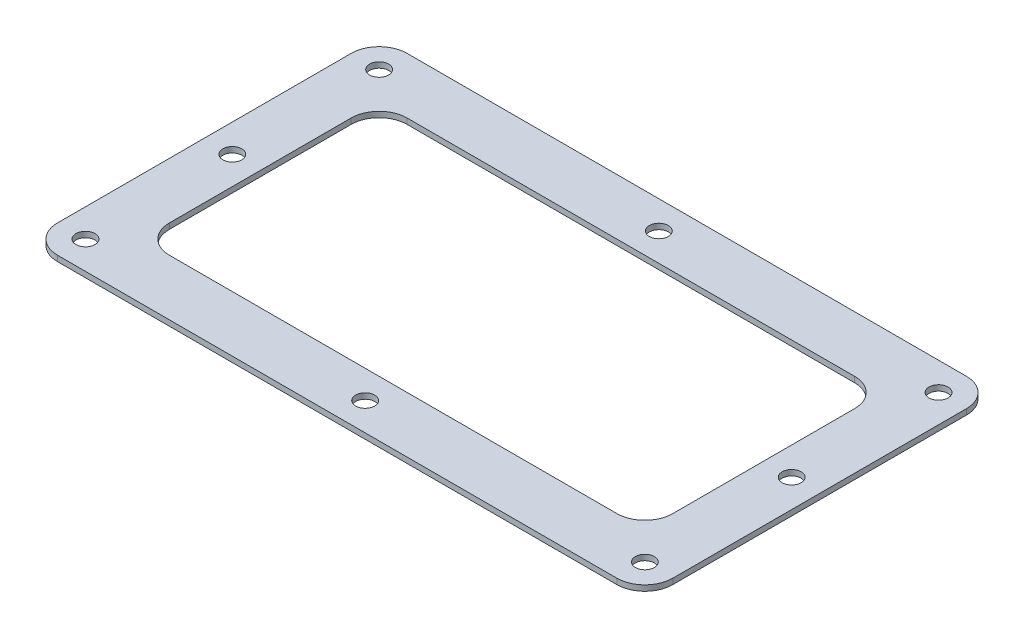
ISO-10303-21;
HEADER;
FILE_DESCRIPTION(('STEP AP214'),'2;1');
FILE_NAME('part.step','',(''),(''),'','','');
FILE_SCHEMA(('AUTOMOTIVE_DESIGN { 1 0 10303 214 1 1 1 1 }'));
ENDSEC;
DATA;
#1=APPLICATION_CONTEXT('core data for automotive mechanical design processes');
#2=APPLICATION_PROTOCOL_DEFINITION('international standard','automotive_design',2000,#1);
#3=PRODUCT_CONTEXT('',#1,'mechanical');
#4=PRODUCT('Part','Part','',(#3));
#5=PRODUCT_RELATED_PRODUCT_CATEGORY('part','',(#4));
#6=PRODUCT_DEFINITION_FORMATION('','',#4);
#7=PRODUCT_DEFINITION_CONTEXT('part definition',#1,'design');
#8=PRODUCT_DEFINITION('design','',#6,#7);
#9=PRODUCT_DEFINITION_SHAPE('','',#8);
#10=(LENGTH_UNIT() NAMED_UNIT(*) SI_UNIT(.MILLI.,.METRE.));
#11=(NAMED_UNIT(*) PLANE_ANGLE_UNIT() SI_UNIT($,.RADIAN.));
#12=(NAMED_UNIT(*) SI_UNIT($,.STERADIAN.) SOLID_ANGLE_UNIT());
#13=UNCERTAINTY_MEASURE_WITH_UNIT(LENGTH_MEASURE(1.E-05),#10,'distance_accuracy_value','');
#14=(GEOMETRIC_REPRESENTATION_CONTEXT(3) GLOBAL_UNCERTAINTY_ASSIGNED_CONTEXT((#13)) GLOBAL_UNIT_ASSIGNED_CONTEXT((#10,
#11,#12)) REPRESENTATION_CONTEXT('',''));
#15=CARTESIAN_POINT('',(0.,0.,0.));
#16=DIRECTION('',(0.,0.,1.));
#17=DIRECTION('',(1.,0.,0.));
#18=AXIS2_PLACEMENT_3D('',#15,#16,#17);
#19=CARTESIAN_POINT('',(142.674698795181,0.,88.0963855421687));
#20=DIRECTION('',(0.,-1.,0.));
#21=DIRECTION('',(0.,0.,-1.));
#22=AXIS2_PLACEMENT_3D('',#19,#20,#21);
#23=PLANE('',#22);
#24=DIRECTION('',(-1.,0.,0.));
#25=VECTOR('',#24,1.);
#26=CARTESIAN_POINT('',(0.,0.,-6.90361445783139));
#27=LINE('',#26,#25);
#28=CARTESIAN_POINT('',(122.674698795181,0.,-6.90361445783128));
#29=VERTEX_POINT('',#28);
#30=CARTESIAN_POINT('',(-37.3253012048192,2.22044604925031E-13,-6.90361445783128));
#31=VERTEX_POINT('',#30);
#32=EDGE_CURVE('E151',#29,#31,#27,.T.);
#33=ORIENTED_EDGE('',*,*,#32,.T.);
#34=CARTESIAN_POINT('',(-37.3253012048192,2.22044604925031E-13,3.09638554216862));
#35=DIRECTION('',(0.,1.,0.));
#36=DIRECTION('',(0.,0.,1.));
#37=AXIS2_PLACEMENT_3D('',#34,#35,#36);
#38=CIRCLE('',#37,10.);
#39=CARTESIAN_POINT('',(-47.3253012048192,0.,3.09638554216873));
#40=VERTEX_POINT('',#39);
#41=EDGE_CURVE('E160',#31,#40,#38,.T.);
#42=ORIENTED_EDGE('',*,*,#41,.T.);
#43=DIRECTION('',(0.,0.,1.));
#44=VECTOR('',#43,1.);
#45=CARTESIAN_POINT('',(-47.3253012048192,0.,0.));
#46=LINE('',#45,#44);
#47=CARTESIAN_POINT('',(-47.3253012048192,2.22044604925031E-13,68.0963855421686));
#48=VERTEX_POINT('',#47);
#49=EDGE_CURVE('E51',#40,#48,#46,.T.);
#50=ORIENTED_EDGE('',*,*,#49,.T.);
#51=CARTESIAN_POINT('',(-37.3253012048193,2.22044604925031E-13,68.0963855421687));
#52=DIRECTION('',(0.,1.,0.));
#53=DIRECTION('',(0.,0.,1.));
#54=AXIS2_PLACEMENT_3D('',#51,#52,#53);
#55=CIRCLE('',#54,10.);
#56=CARTESIAN_POINT('',(-37.3253012048192,2.22044604925031E-13,78.0963855421687));
#57=VERTEX_POINT('',#56);
#58=EDGE_CURVE('E174',#48,#57,#55,.T.);
#59=ORIENTED_EDGE('',*,*,#58,.T.);
#60=DIRECTION('',(1.,0.,0.));
#61=VECTOR('',#60,1.);
#62=CARTESIAN_POINT('',(0.,0.,78.0963855421687));
#63=LINE('',#62,#61);
#64=CARTESIAN_POINT('',(122.674698795181,0.,78.0963855421688));
#65=VERTEX_POINT('',#64);
#66=EDGE_CURVE('E177',#57,#65,#63,.T.);
#67=ORIENTED_EDGE('',*,*,#66,.T.);
#68=CARTESIAN_POINT('',(122.674698795181,0.,68.0963855421688));
#69=DIRECTION('',(0.,1.,0.));
#70=DIRECTION('',(0.,0.,1.));
#71=AXIS2_PLACEMENT_3D('',#68,#69,#70);
#72=CIRCLE('',#71,9.99999999999999);
#73=CARTESIAN_POINT('',(132.674698795181,0.,68.0963855421687));
#74=VERTEX_POINT('',#73);
#75=EDGE_CURVE('E180',#65,#74,#72,.T.);
#76=ORIENTED_EDGE('',*,*,#75,.T.);
#77=DIRECTION('',(0.,0.,-1.));
#78=VECTOR('',#77,1.);
#79=CARTESIAN_POINT('',(132.674698795181,0.,1.11022302462516E-13));
#80=LINE('',#79,#78);
#81=CARTESIAN_POINT('',(132.674698795181,0.,3.09638554216884));
#82=VERTEX_POINT('',#81);
#83=EDGE_CURVE('E183',#74,#82,#80,.T.);
#84=ORIENTED_EDGE('',*,*,#83,.T.);
#85=CARTESIAN_POINT('',(122.674698795181,0.,3.09638554216873));
#86=DIRECTION('',(0.,1.,0.));
#87=DIRECTION('',(0.,0.,1.));
#88=AXIS2_PLACEMENT_3D('',#85,#86,#87);
#89=CIRCLE('',#88,10.);
#90=EDGE_CURVE('E157',#82,#29,#89,.T.);
#91=ORIENTED_EDGE('',*,*,#90,.T.);
#92=EDGE_LOOP('',(#33,#42,#50,#59,#67,#76,#84,#91));
#93=FACE_BOUND('',#92,.T.);
#94=CARTESIAN_POINT('',(-57.3253012048192,0.,-16.9036144578313));
#95=DIRECTION('',(0.,1.,0.));
#96=DIRECTION('',(0.,0.,1.));
#97=AXIS2_PLACEMENT_3D('',#94,#95,#96);
#98=CIRCLE('',#97,3.4);
#99=CARTESIAN_POINT('',(-57.3253012048192,0.,-13.5036144578313));
#100=VERTEX_POINT('',#99);
#101=EDGE_CURVE('E219',#100,#100,#98,.T.);
#102=ORIENTED_EDGE('',*,*,#101,.T.);
#103=EDGE_LOOP('',(#102));
#104=FACE_BOUND('',#103,.T.);
#105=CARTESIAN_POINT('',(142.674698795181,0.,-16.9036144578313));
#106=DIRECTION('',(0.,1.,0.));
#107=DIRECTION('',(0.,0.,1.));
#108=AXIS2_PLACEMENT_3D('',#105,#106,#107);
#109=CIRCLE('',#108,3.39999999999999);
#110=CARTESIAN_POINT('',(142.674698795181,0.,-13.5036144578313));
#111=VERTEX_POINT('',#110);
#112=EDGE_CURVE('E225',#111,#111,#109,.T.);
#113=ORIENTED_EDGE('',*,*,#112,.T.);
#114=EDGE_LOOP('',(#113));
#115=FACE_BOUND('',#114,.T.);
#116=CARTESIAN_POINT('',(-57.3253012048193,0.,88.0963855421687));
#117=DIRECTION('',(0.,1.,0.));
#118=DIRECTION('',(0.,0.,1.));
#119=AXIS2_PLACEMENT_3D('',#116,#117,#118);
#120=CIRCLE('',#119,3.4);
#121=CARTESIAN_POINT('',(-57.3253012048193,0.,91.4963855421687));
#122=VERTEX_POINT('',#121);
#123=EDGE_CURVE('E231',#122,#122,#120,.T.);
#124=ORIENTED_EDGE('',*,*,#123,.T.);
#125=EDGE_LOOP('',(#124));
#126=FACE_BOUND('',#125,.T.);
#127=CARTESIAN_POINT('',(142.674698795181,0.,88.0963855421687));
#128=DIRECTION('',(0.,1.,0.));
#129=DIRECTION('',(0.,0.,1.));
#130=AXIS2_PLACEMENT_3D('',#127,#128,#129);
#131=CIRCLE('',#130,3.39999999999999);
#132=CARTESIAN_POINT('',(142.674698795181,0.,91.4963855421687));
#133=VERTEX_POINT('',#132);
#134=EDGE_CURVE('E237',#133,#133,#131,.T.);
#135=ORIENTED_EDGE('',*,*,#134,.T.);
#136=EDGE_LOOP('',(#135));
#137=FACE_BOUND('',#136,.T.);
#138=CARTESIAN_POINT('',(42.6746987951807,0.,88.0963855421688));
#139=DIRECTION('',(0.,1.,0.));
#140=DIRECTION('',(0.,0.,1.));
#141=AXIS2_PLACEMENT_3D('',#138,#139,#140);
#142=CIRCLE('',#141,3.4);
#143=CARTESIAN_POINT('',(42.6746987951807,0.,91.4963855421688));
#144=VERTEX_POINT('',#143);
#145=EDGE_CURVE('E243',#144,#144,#142,.T.);
#146=ORIENTED_EDGE('',*,*,#145,.T.);
#147=EDGE_LOOP('',(#146));
#148=FACE_BOUND('',#147,.T.);
#149=CARTESIAN_POINT('',(142.674698795181,0.,88.0963855421687));
#150=DIRECTION('',(0.,1.,0.));
#151=DIRECTION('',(0.,0.,-1.));
#152=AXIS2_PLACEMENT_3D('',#149,#150,#151);
#153=CIRCLE('',#152,10.);
#154=CARTESIAN_POINT('',(142.674698795181,0.,98.0963855421687));
#155=VERTEX_POINT('',#154);
#156=CARTESIAN_POINT('',(152.674698795181,0.,88.0963855421687));
#157=VERTEX_POINT('',#156);
#158=EDGE_CURVE('E264',#155,#157,#153,.T.);
#159=ORIENTED_EDGE('',*,*,#158,.F.);
#160=DIRECTION('',(1.,0.,0.));
#161=VECTOR('',#160,1.);
#162=CARTESIAN_POINT('',(142.674698795181,0.,98.0963855421687));
#163=LINE('',#162,#161);
#164=CARTESIAN_POINT('',(-57.3253012048192,0.,98.0963855421687));
#165=VERTEX_POINT('',#164);
#166=EDGE_CURVE('E269',#165,#155,#163,.T.);
#167=ORIENTED_EDGE('',*,*,#166,.F.);
#168=CARTESIAN_POINT('',(-57.3253012048193,0.,88.0963855421687));
#169=DIRECTION('',(0.,1.,0.));
#170=DIRECTION('',(0.,0.,-1.));
#171=AXIS2_PLACEMENT_3D('',#168,#169,#170);
#172=CIRCLE('',#171,10.);
#173=CARTESIAN_POINT('',(-67.3253012048193,0.,88.0963855421686));
#174=VERTEX_POINT('',#173);
#175=EDGE_CURVE('E296',#174,#165,#172,.T.);
#176=ORIENTED_EDGE('',*,*,#175,.F.);
#177=DIRECTION('',(0.,0.,1.));
#178=VECTOR('',#177,1.);
#179=CARTESIAN_POINT('',(-67.3253012048193,0.,88.0963855421686));
#180=LINE('',#179,#178);
#181=CARTESIAN_POINT('',(-67.3253012048192,0.,-16.9036144578313));
#182=VERTEX_POINT('',#181);
#183=EDGE_CURVE('E294',#182,#174,#180,.T.);
#184=ORIENTED_EDGE('',*,*,#183,.F.);
#185=CARTESIAN_POINT('',(-57.3253012048192,0.,-16.9036144578313));
#186=DIRECTION('',(0.,1.,0.));
#187=DIRECTION('',(0.,0.,1.));
#188=AXIS2_PLACEMENT_3D('',#185,#186,#187);
#189=CIRCLE('',#188,10.);
#190=CARTESIAN_POINT('',(-57.3253012048192,0.,-26.9036144578313));
#191=VERTEX_POINT('',#190);
#192=EDGE_CURVE('E292',#191,#182,#189,.T.);
#193=ORIENTED_EDGE('',*,*,#192,.F.);
#194=DIRECTION('',(-1.,0.,0.));
#195=VECTOR('',#194,1.);
#196=CARTESIAN_POINT('',(-57.3253012048192,0.,-26.9036144578313));
#197=LINE('',#196,#195);
#198=CARTESIAN_POINT('',(142.674698795181,0.,-26.9036144578313));
#199=VERTEX_POINT('',#198);
#200=EDGE_CURVE('E290',#199,#191,#197,.T.);
#201=ORIENTED_EDGE('',*,*,#200,.F.);
#202=CARTESIAN_POINT('',(142.674698795181,0.,-16.9036144578313));
#203=DIRECTION('',(0.,1.,0.));
#204=DIRECTION('',(0.,0.,-1.));
#205=AXIS2_PLACEMENT_3D('',#202,#203,#204);
#206=CIRCLE('',#205,10.);
#207=CARTESIAN_POINT('',(152.674698795181,0.,-16.9036144578312));
#208=VERTEX_POINT('',#207);
#209=EDGE_CURVE('E288',#208,#199,#206,.T.);
#210=ORIENTED_EDGE('',*,*,#209,.F.);
#211=DIRECTION('',(0.,0.,-1.));
#212=VECTOR('',#211,1.);
#213=CARTESIAN_POINT('',(152.674698795181,0.,-16.9036144578312));
#214=LINE('',#213,#212);
#215=EDGE_CURVE('E286',#157,#208,#214,.T.);
#216=ORIENTED_EDGE('',*,*,#215,.F.);
#217=EDGE_LOOP('',(#159,#167,#176,#184,#193,#201,#210,#216));
#218=FACE_BOUND('',#217,.T.);
#219=CARTESIAN_POINT('',(-57.3253012048192,0.,35.5963855421687));
#220=DIRECTION('',(0.,1.,0.));
#221=DIRECTION('',(0.,0.,1.));
#222=AXIS2_PLACEMENT_3D('',#219,#220,#221);
#223=CIRCLE('',#222,3.4);
#224=CARTESIAN_POINT('',(-57.3253012048192,0.,38.9963855421687));
#225=VERTEX_POINT('',#224);
#226=EDGE_CURVE('E261',#225,#225,#223,.T.);
#227=ORIENTED_EDGE('',*,*,#226,.T.);
#228=EDGE_LOOP('',(#227));
#229=FACE_BOUND('',#228,.T.);
#230=CARTESIAN_POINT('',(142.674698795181,0.,35.5963855421687));
#231=DIRECTION('',(0.,1.,0.));
#232=DIRECTION('',(0.,0.,1.));
#233=AXIS2_PLACEMENT_3D('',#230,#231,#232);
#234=CIRCLE('',#233,3.39999999999999);
#235=CARTESIAN_POINT('',(142.674698795181,0.,38.9963855421687));
#236=VERTEX_POINT('',#235);
#237=EDGE_CURVE('E255',#236,#236,#234,.T.);
#238=ORIENTED_EDGE('',*,*,#237,.T.);
#239=EDGE_LOOP('',(#238));
#240=FACE_BOUND('',#239,.T.);
#241=CARTESIAN_POINT('',(42.6746987951807,0.,-16.9036144578313));
#242=DIRECTION('',(0.,1.,0.));
#243=DIRECTION('',(0.,0.,1.));
#244=AXIS2_PLACEMENT_3D('',#241,#242,#243);
#245=CIRCLE('',#244,3.4);
#246=CARTESIAN_POINT('',(42.6746987951807,0.,-13.5036144578313));
#247=VERTEX_POINT('',#246);
#248=EDGE_CURVE('E249',#247,#247,#245,.T.);
#249=ORIENTED_EDGE('',*,*,#248,.T.);
#250=EDGE_LOOP('',(#249));
#251=FACE_BOUND('',#250,.T.);
#252=ADVANCED_FACE('F36',(#93,#104,#115,#126,#137,#148,#218,#229,#240,#251),#23,.T.);
#253=CARTESIAN_POINT('',(142.674698795181,2.00000000000022,88.0963855421687));
#254=DIRECTION('',(0.,-1.,0.));
#255=DIRECTION('',(0.,0.,-1.));
#256=AXIS2_PLACEMENT_3D('',#253,#254,#255);
#257=CYLINDRICAL_SURFACE('',#256,10.);
#258=ORIENTED_EDGE('',*,*,#158,.T.);
#259=DIRECTION('',(0.,-1.,0.));
#260=VECTOR('',#259,1.);
#261=CARTESIAN_POINT('',(152.674698795181,2.,88.0963855421687));
#262=LINE('',#261,#260);
#263=CARTESIAN_POINT('',(152.674698795181,2.,88.0963855421687));
#264=VERTEX_POINT('',#263);
#265=EDGE_CURVE('E11',#264,#157,#262,.T.);
#266=ORIENTED_EDGE('',*,*,#265,.F.);
#267=CARTESIAN_POINT('',(142.674698795181,2.00000000000022,88.0963855421687));
#268=DIRECTION('',(0.,1.,0.));
#269=DIRECTION('',(0.,0.,-1.));
#270=AXIS2_PLACEMENT_3D('',#267,#268,#269);
#271=CIRCLE('',#270,10.);
#272=CARTESIAN_POINT('',(142.674698795181,2.00000000000022,98.0963855421687));
#273=VERTEX_POINT('',#272);
#274=EDGE_CURVE('E265',#273,#264,#271,.T.);
#275=ORIENTED_EDGE('',*,*,#274,.F.);
#276=DIRECTION('',(0.,-1.,0.));
#277=VECTOR('',#276,1.);
#278=CARTESIAN_POINT('',(142.674698795181,2.00000000000022,98.0963855421687));
#279=LINE('',#278,#277);
#280=EDGE_CURVE('E283',#273,#155,#279,.T.);
#281=ORIENTED_EDGE('',*,*,#280,.T.);
#282=EDGE_LOOP('',(#258,#266,#275,#281));
#283=FACE_BOUND('',#282,.T.);
#284=ADVANCED_FACE('F38',(#283),#257,.T.);
#285=CARTESIAN_POINT('',(152.674698795181,2.,-16.9036144578312));
#286=DIRECTION('',(-1.,0.,0.));
#287=DIRECTION('',(0.,0.,1.));
#288=AXIS2_PLACEMENT_3D('',#285,#286,#287);
#289=PLANE('',#288);
#290=ORIENTED_EDGE('',*,*,#215,.T.);
#291=DIRECTION('',(0.,-1.,0.));
#292=VECTOR('',#291,1.);
#293=CARTESIAN_POINT('',(152.674698795181,2.,-16.9036144578312));
#294=LINE('',#293,#292);
#295=CARTESIAN_POINT('',(152.674698795181,2.,-16.9036144578312));
#296=VERTEX_POINT('',#295);
#297=EDGE_CURVE('E44',#296,#208,#294,.T.);
#298=ORIENTED_EDGE('',*,*,#297,.F.);
#299=DIRECTION('',(0.,0.,-1.));
#300=VECTOR('',#299,1.);
#301=CARTESIAN_POINT('',(152.674698795181,2.,-16.9036144578312));
#302=LINE('',#301,#300);
#303=EDGE_CURVE('E268',#264,#296,#302,.T.);
#304=ORIENTED_EDGE('',*,*,#303,.F.);
#305=ORIENTED_EDGE('',*,*,#265,.T.);
#306=EDGE_LOOP('',(#290,#298,#304,#305));
#307=FACE_BOUND('',#306,.T.);
#308=ADVANCED_FACE('F343',(#307),#289,.F.);
#309=CARTESIAN_POINT('',(142.674698795181,2.00000000000022,-16.9036144578313));
#310=DIRECTION('',(0.,-1.,0.));
#311=DIRECTION('',(0.,0.,-1.));
#312=AXIS2_PLACEMENT_3D('',#309,#310,#311);
#313=CYLINDRICAL_SURFACE('',#312,10.);
#314=ORIENTED_EDGE('',*,*,#209,.T.);
#315=DIRECTION('',(0.,-1.,0.));
#316=VECTOR('',#315,1.);
#317=CARTESIAN_POINT('',(142.674698795181,2.00000000000022,-26.9036144578313));
#318=LINE('',#317,#316);
#319=CARTESIAN_POINT('',(142.674698795181,2.00000000000022,-26.9036144578313));
#320=VERTEX_POINT('',#319);
#321=EDGE_CURVE('E313',#320,#199,#318,.T.);
#322=ORIENTED_EDGE('',*,*,#321,.F.);
#323=CARTESIAN_POINT('',(142.674698795181,2.00000000000022,-16.9036144578313));
#324=DIRECTION('',(0.,1.,0.));
#325=DIRECTION('',(0.,0.,-1.));
#326=AXIS2_PLACEMENT_3D('',#323,#324,#325);
#327=CIRCLE('',#326,10.);
#328=EDGE_CURVE('E271',#296,#320,#327,.T.);
#329=ORIENTED_EDGE('',*,*,#328,.F.);
#330=ORIENTED_EDGE('',*,*,#297,.T.);
#331=EDGE_LOOP('',(#314,#322,#329,#330));
#332=FACE_BOUND('',#331,.T.);
#333=ADVANCED_FACE('F320',(#332),#313,.T.);
#334=CARTESIAN_POINT('',(-57.3253012048192,2.,-26.9036144578313));
#335=DIRECTION('',(0.,0.,1.));
#336=DIRECTION('',(1.,0.,0.));
#337=AXIS2_PLACEMENT_3D('',#334,#335,#336);
#338=PLANE('',#337);
#339=ORIENTED_EDGE('',*,*,#200,.T.);
#340=DIRECTION('',(0.,-1.,0.));
#341=VECTOR('',#340,1.);
#342=CARTESIAN_POINT('',(-57.3253012048192,2.,-26.9036144578313));
#343=LINE('',#342,#341);
#344=CARTESIAN_POINT('',(-57.3253012048192,2.,-26.9036144578313));
#345=VERTEX_POINT('',#344);
#346=EDGE_CURVE('E310',#345,#191,#343,.T.);
#347=ORIENTED_EDGE('',*,*,#346,.F.);
#348=DIRECTION('',(-1.,0.,0.));
#349=VECTOR('',#348,1.);
#350=CARTESIAN_POINT('',(-57.3253012048192,2.,-26.9036144578313));
#351=LINE('',#350,#349);
#352=EDGE_CURVE('E273',#320,#345,#351,.T.);
#353=ORIENTED_EDGE('',*,*,#352,.F.);
#354=ORIENTED_EDGE('',*,*,#321,.T.);
#355=EDGE_LOOP('',(#339,#347,#353,#354));
#356=FACE_BOUND('',#355,.T.);
#357=ADVANCED_FACE('F331',(#356),#338,.F.);
#358=CARTESIAN_POINT('',(-57.3253012048193,2.,-16.9036144578313));
#359=DIRECTION('',(0.,-1.,0.));
#360=DIRECTION('',(0.,0.,-1.));
#361=AXIS2_PLACEMENT_3D('',#358,#359,#360);
#362=CYLINDRICAL_SURFACE('',#361,10.);
#363=ORIENTED_EDGE('',*,*,#192,.T.);
#364=DIRECTION('',(0.,-1.,0.));
#365=VECTOR('',#364,1.);
#366=CARTESIAN_POINT('',(-67.3253012048193,2.00000000000022,-16.9036144578313));
#367=LINE('',#366,#365);
#368=CARTESIAN_POINT('',(-67.3253012048193,2.00000000000022,-16.9036144578313));
#369=VERTEX_POINT('',#368);
#370=EDGE_CURVE('E307',#369,#182,#367,.T.);
#371=ORIENTED_EDGE('',*,*,#370,.F.);
#372=CARTESIAN_POINT('',(-57.3253012048193,2.,-16.9036144578313));
#373=DIRECTION('',(0.,1.,0.));
#374=DIRECTION('',(0.,0.,1.));
#375=AXIS2_PLACEMENT_3D('',#372,#373,#374);
#376=CIRCLE('',#375,10.);
#377=EDGE_CURVE('E275',#345,#369,#376,.T.);
#378=ORIENTED_EDGE('',*,*,#377,.F.);
#379=ORIENTED_EDGE('',*,*,#346,.T.);
#380=EDGE_LOOP('',(#363,#371,#378,#379));
#381=FACE_BOUND('',#380,.T.);
#382=ADVANCED_FACE('F335',(#381),#362,.T.);
#383=CARTESIAN_POINT('',(-67.3253012048193,2.00000000000022,88.0963855421686));
#384=DIRECTION('',(1.,0.,0.));
#385=DIRECTION('',(0.,0.,-1.));
#386=AXIS2_PLACEMENT_3D('',#383,#384,#385);
#387=PLANE('',#386);
#388=ORIENTED_EDGE('',*,*,#183,.T.);
#389=DIRECTION('',(0.,-1.,0.));
#390=VECTOR('',#389,1.);
#391=CARTESIAN_POINT('',(-67.3253012048193,2.00000000000022,88.0963855421686));
#392=LINE('',#391,#390);
#393=CARTESIAN_POINT('',(-67.3253012048193,2.00000000000022,88.0963855421686));
#394=VERTEX_POINT('',#393);
#395=EDGE_CURVE('E304',#394,#174,#392,.T.);
#396=ORIENTED_EDGE('',*,*,#395,.F.);
#397=DIRECTION('',(0.,0.,1.));
#398=VECTOR('',#397,1.);
#399=CARTESIAN_POINT('',(-67.3253012048193,2.00000000000022,88.0963855421686));
#400=LINE('',#399,#398);
#401=EDGE_CURVE('E277',#369,#394,#400,.T.);
#402=ORIENTED_EDGE('',*,*,#401,.F.);
#403=ORIENTED_EDGE('',*,*,#370,.T.);
#404=EDGE_LOOP('',(#388,#396,#402,#403));
#405=FACE_BOUND('',#404,.T.);
#406=ADVANCED_FACE('F356',(#405),#387,.F.);
#407=CARTESIAN_POINT('',(-57.3253012048193,2.,88.0963855421687));
#408=DIRECTION('',(0.,-1.,0.));
#409=DIRECTION('',(0.,0.,-1.));
#410=AXIS2_PLACEMENT_3D('',#407,#408,#409);
#411=CYLINDRICAL_SURFACE('',#410,10.);
#412=ORIENTED_EDGE('',*,*,#175,.T.);
#413=DIRECTION('',(0.,-1.,0.));
#414=VECTOR('',#413,1.);
#415=CARTESIAN_POINT('',(-57.3253012048192,2.,98.0963855421687));
#416=LINE('',#415,#414);
#417=CARTESIAN_POINT('',(-57.3253012048192,2.,98.0963855421687));
#418=VERTEX_POINT('',#417);
#419=EDGE_CURVE('E301',#418,#165,#416,.T.);
#420=ORIENTED_EDGE('',*,*,#419,.F.);
#421=CARTESIAN_POINT('',(-57.3253012048193,2.,88.0963855421687));
#422=DIRECTION('',(0.,1.,0.));
#423=DIRECTION('',(0.,0.,-1.));
#424=AXIS2_PLACEMENT_3D('',#421,#422,#423);
#425=CIRCLE('',#424,10.);
#426=EDGE_CURVE('E279',#394,#418,#425,.T.);
#427=ORIENTED_EDGE('',*,*,#426,.F.);
#428=ORIENTED_EDGE('',*,*,#395,.T.);
#429=EDGE_LOOP('',(#412,#420,#427,#428));
#430=FACE_BOUND('',#429,.T.);
#431=ADVANCED_FACE('F354',(#430),#411,.T.);
#432=CARTESIAN_POINT('',(142.674698795181,2.00000000000022,98.0963855421687));
#433=DIRECTION('',(0.,0.,-1.));
#434=DIRECTION('',(-1.,0.,0.));
#435=AXIS2_PLACEMENT_3D('',#432,#433,#434);
#436=PLANE('',#435);
#437=ORIENTED_EDGE('',*,*,#166,.T.);
#438=ORIENTED_EDGE('',*,*,#280,.F.);
#439=DIRECTION('',(1.,0.,0.));
#440=VECTOR('',#439,1.);
#441=CARTESIAN_POINT('',(142.674698795181,2.00000000000022,98.0963855421687));
#442=LINE('',#441,#440);
#443=EDGE_CURVE('E281',#418,#273,#442,.T.);
#444=ORIENTED_EDGE('',*,*,#443,.F.);
#445=ORIENTED_EDGE('',*,*,#419,.T.);
#446=EDGE_LOOP('',(#437,#438,#444,#445));
#447=FACE_BOUND('',#446,.T.);
#448=ADVANCED_FACE('F349',(#447),#436,.F.);
#449=CARTESIAN_POINT('',(142.674698795181,2.00000000000022,88.0963855421687));
#450=DIRECTION('',(0.,-1.,0.));
#451=DIRECTION('',(0.,0.,-1.));
#452=AXIS2_PLACEMENT_3D('',#449,#450,#451);
#453=PLANE('',#452);
#454=CARTESIAN_POINT('',(-37.3253012048193,2.,3.09638554216862));
#455=DIRECTION('',(0.,1.,0.));
#456=DIRECTION('',(0.,0.,1.));
#457=AXIS2_PLACEMENT_3D('',#454,#455,#456);
#458=CIRCLE('',#457,10.);
#459=CARTESIAN_POINT('',(-37.3253012048193,2.,-6.90361445783128));
#460=VERTEX_POINT('',#459);
#461=CARTESIAN_POINT('',(-47.3253012048193,2.00000000000022,3.09638554216873));
#462=VERTEX_POINT('',#461);
#463=EDGE_CURVE('E187',#460,#462,#458,.T.);
#464=ORIENTED_EDGE('',*,*,#463,.F.);
#465=DIRECTION('',(-1.,0.,0.));
#466=VECTOR('',#465,1.);
#467=CARTESIAN_POINT('',(0.,2.,-6.90361445783139));
#468=LINE('',#467,#466);
#469=CARTESIAN_POINT('',(122.674698795181,2.00000000000022,-6.90361445783128));
#470=VERTEX_POINT('',#469);
#471=EDGE_CURVE('E59',#470,#460,#468,.T.);
#472=ORIENTED_EDGE('',*,*,#471,.F.);
#473=CARTESIAN_POINT('',(122.674698795181,2.00000000000022,3.09638554216873));
#474=DIRECTION('',(0.,1.,0.));
#475=DIRECTION('',(0.,0.,1.));
#476=AXIS2_PLACEMENT_3D('',#473,#474,#475);
#477=CIRCLE('',#476,10.);
#478=CARTESIAN_POINT('',(132.674698795181,2.00000000000022,3.09638554216884));
#479=VERTEX_POINT('',#478);
#480=EDGE_CURVE('E167',#479,#470,#477,.T.);
#481=ORIENTED_EDGE('',*,*,#480,.F.);
#482=DIRECTION('',(0.,0.,-1.));
#483=VECTOR('',#482,1.);
#484=CARTESIAN_POINT('',(132.674698795181,2.00000000000022,1.11022302462516E-13));
#485=LINE('',#484,#483);
#486=CARTESIAN_POINT('',(132.674698795181,2.00000000000022,68.0963855421687));
#487=VERTEX_POINT('',#486);
#488=EDGE_CURVE('E170',#487,#479,#485,.T.);
#489=ORIENTED_EDGE('',*,*,#488,.F.);
#490=CARTESIAN_POINT('',(122.674698795181,2.,68.0963855421688));
#491=DIRECTION('',(0.,1.,0.));
#492=DIRECTION('',(0.,0.,1.));
#493=AXIS2_PLACEMENT_3D('',#490,#491,#492);
#494=CIRCLE('',#493,9.99999999999999);
#495=CARTESIAN_POINT('',(122.674698795181,2.00000000000022,78.0963855421688));
#496=VERTEX_POINT('',#495);
#497=EDGE_CURVE('E198',#496,#487,#494,.T.);
#498=ORIENTED_EDGE('',*,*,#497,.F.);
#499=DIRECTION('',(1.,0.,0.));
#500=VECTOR('',#499,1.);
#501=CARTESIAN_POINT('',(0.,2.,78.0963855421687));
#502=LINE('',#501,#500);
#503=CARTESIAN_POINT('',(-37.3253012048192,2.,78.0963855421687));
#504=VERTEX_POINT('',#503);
#505=EDGE_CURVE('E195',#504,#496,#502,.T.);
#506=ORIENTED_EDGE('',*,*,#505,.F.);
#507=CARTESIAN_POINT('',(-37.3253012048193,2.,68.0963855421687));
#508=DIRECTION('',(0.,1.,0.));
#509=DIRECTION('',(0.,0.,1.));
#510=AXIS2_PLACEMENT_3D('',#507,#508,#509);
#511=CIRCLE('',#510,10.);
#512=CARTESIAN_POINT('',(-47.3253012048193,2.00000000000022,68.0963855421686));
#513=VERTEX_POINT('',#512);
#514=EDGE_CURVE('E192',#513,#504,#511,.T.);
#515=ORIENTED_EDGE('',*,*,#514,.F.);
#516=DIRECTION('',(0.,0.,1.));
#517=VECTOR('',#516,1.);
#518=CARTESIAN_POINT('',(-47.3253012048193,2.00000000000022,0.));
#519=LINE('',#518,#517);
#520=EDGE_CURVE('E189',#462,#513,#519,.T.);
#521=ORIENTED_EDGE('',*,*,#520,.F.);
#522=EDGE_LOOP('',(#464,#472,#481,#489,#498,#506,#515,#521));
#523=FACE_BOUND('',#522,.T.);
#524=CARTESIAN_POINT('',(-57.3253012048193,2.,-16.9036144578313));
#525=DIRECTION('',(0.,1.,0.));
#526=DIRECTION('',(0.,0.,1.));
#527=AXIS2_PLACEMENT_3D('',#524,#525,#526);
#528=CIRCLE('',#527,3.39999999999999);
#529=CARTESIAN_POINT('',(-57.3253012048193,2.,-13.5036144578313));
#530=VERTEX_POINT('',#529);
#531=EDGE_CURVE('E205',#530,#530,#528,.T.);
#532=ORIENTED_EDGE('',*,*,#531,.F.);
#533=EDGE_LOOP('',(#532));
#534=FACE_BOUND('',#533,.T.);
#535=CARTESIAN_POINT('',(142.674698795181,2.00000000000022,-16.9036144578313));
#536=DIRECTION('',(0.,1.,0.));
#537=DIRECTION('',(0.,0.,1.));
#538=AXIS2_PLACEMENT_3D('',#535,#536,#537);
#539=CIRCLE('',#538,3.39999999999999);
#540=CARTESIAN_POINT('',(142.674698795181,2.00000000000022,-13.5036144578313));
#541=VERTEX_POINT('',#540);
#542=EDGE_CURVE('E222',#541,#541,#539,.T.);
#543=ORIENTED_EDGE('',*,*,#542,.F.);
#544=EDGE_LOOP('',(#543));
#545=FACE_BOUND('',#544,.T.);
#546=CARTESIAN_POINT('',(-57.3253012048193,2.,88.0963855421687));
#547=DIRECTION('',(0.,1.,0.));
#548=DIRECTION('',(0.,0.,1.));
#549=AXIS2_PLACEMENT_3D('',#546,#547,#548);
#550=CIRCLE('',#549,3.39999999999999);
#551=CARTESIAN_POINT('',(-57.3253012048193,2.,91.4963855421687));
#552=VERTEX_POINT('',#551);
#553=EDGE_CURVE('E228',#552,#552,#550,.T.);
#554=ORIENTED_EDGE('',*,*,#553,.F.);
#555=EDGE_LOOP('',(#554));
#556=FACE_BOUND('',#555,.T.);
#557=CARTESIAN_POINT('',(142.674698795181,2.00000000000022,88.0963855421687));
#558=DIRECTION('',(0.,1.,0.));
#559=DIRECTION('',(0.,0.,1.));
#560=AXIS2_PLACEMENT_3D('',#557,#558,#559);
#561=CIRCLE('',#560,3.39999999999999);
#562=CARTESIAN_POINT('',(142.674698795181,2.00000000000022,91.4963855421687));
#563=VERTEX_POINT('',#562);
#564=EDGE_CURVE('E234',#563,#563,#561,.T.);
#565=ORIENTED_EDGE('',*,*,#564,.F.);
#566=EDGE_LOOP('',(#565));
#567=FACE_BOUND('',#566,.T.);
#568=CARTESIAN_POINT('',(42.6746987951807,2.,88.0963855421688));
#569=DIRECTION('',(0.,1.,0.));
#570=DIRECTION('',(0.,0.,1.));
#571=AXIS2_PLACEMENT_3D('',#568,#569,#570);
#572=CIRCLE('',#571,3.39999999999999);
#573=CARTESIAN_POINT('',(42.6746987951807,2.,91.4963855421688));
#574=VERTEX_POINT('',#573);
#575=EDGE_CURVE('E240',#574,#574,#572,.T.);
#576=ORIENTED_EDGE('',*,*,#575,.F.);
#577=EDGE_LOOP('',(#576));
#578=FACE_BOUND('',#577,.T.);
#579=CARTESIAN_POINT('',(42.6746987951807,2.,-16.9036144578313));
#580=DIRECTION('',(0.,1.,0.));
#581=DIRECTION('',(0.,0.,1.));
#582=AXIS2_PLACEMENT_3D('',#579,#580,#581);
#583=CIRCLE('',#582,3.39999999999999);
#584=CARTESIAN_POINT('',(42.6746987951807,2.,-13.5036144578313));
#585=VERTEX_POINT('',#584);
#586=EDGE_CURVE('E246',#585,#585,#583,.T.);
#587=ORIENTED_EDGE('',*,*,#586,.F.);
#588=EDGE_LOOP('',(#587));
#589=FACE_BOUND('',#588,.T.);
#590=CARTESIAN_POINT('',(142.674698795181,2.00000000000022,35.5963855421687));
#591=DIRECTION('',(0.,1.,0.));
#592=DIRECTION('',(0.,0.,1.));
#593=AXIS2_PLACEMENT_3D('',#590,#591,#592);
#594=CIRCLE('',#593,3.39999999999999);
#595=CARTESIAN_POINT('',(142.674698795181,2.00000000000022,38.9963855421687));
#596=VERTEX_POINT('',#595);
#597=EDGE_CURVE('E252',#596,#596,#594,.T.);
#598=ORIENTED_EDGE('',*,*,#597,.F.);
#599=EDGE_LOOP('',(#598));
#600=FACE_BOUND('',#599,.T.);
#601=CARTESIAN_POINT('',(-57.3253012048193,2.,35.5963855421687));
#602=DIRECTION('',(0.,1.,0.));
#603=DIRECTION('',(0.,0.,1.));
#604=AXIS2_PLACEMENT_3D('',#601,#602,#603);
#605=CIRCLE('',#604,3.39999999999999);
#606=CARTESIAN_POINT('',(-57.3253012048193,2.,38.9963855421687));
#607=VERTEX_POINT('',#606);
#608=EDGE_CURVE('E258',#607,#607,#605,.T.);
#609=ORIENTED_EDGE('',*,*,#608,.F.);
#610=EDGE_LOOP('',(#609));
#611=FACE_BOUND('',#610,.T.);
#612=ORIENTED_EDGE('',*,*,#274,.T.);
#613=ORIENTED_EDGE('',*,*,#303,.T.);
#614=ORIENTED_EDGE('',*,*,#328,.T.);
#615=ORIENTED_EDGE('',*,*,#352,.T.);
#616=ORIENTED_EDGE('',*,*,#377,.T.);
#617=ORIENTED_EDGE('',*,*,#401,.T.);
#618=ORIENTED_EDGE('',*,*,#426,.T.);
#619=ORIENTED_EDGE('',*,*,#443,.T.);
#620=EDGE_LOOP('',(#612,#613,#614,#615,#616,#617,#618,#619));
#621=FACE_BOUND('',#620,.T.);
#622=ADVANCED_FACE('F339',(#523,#534,#545,#556,#567,#578,#589,#600,#611,#621),#453,.F.);
#623=CARTESIAN_POINT('',(-57.3253012048193,2.,35.5963855421687));
#624=DIRECTION('',(0.,1.,0.));
#625=DIRECTION('',(0.,0.,1.));
#626=AXIS2_PLACEMENT_3D('',#623,#624,#625);
#627=CYLINDRICAL_SURFACE('',#626,3.39999999999999);
#628=ORIENTED_EDGE('',*,*,#226,.F.);
#629=EDGE_LOOP('',(#628));
#630=FACE_BOUND('',#629,.T.);
#631=ORIENTED_EDGE('',*,*,#608,.T.);
#632=EDGE_LOOP('',(#631));
#633=FACE_BOUND('',#632,.T.);
#634=ADVANCED_FACE('F377',(#630,#633),#627,.F.);
#635=CARTESIAN_POINT('',(142.674698795181,2.00000000000022,35.5963855421687));
#636=DIRECTION('',(0.,1.,0.));
#637=DIRECTION('',(0.,0.,1.));
#638=AXIS2_PLACEMENT_3D('',#635,#636,#637);
#639=CYLINDRICAL_SURFACE('',#638,3.39999999999999);
#640=ORIENTED_EDGE('',*,*,#237,.F.);
#641=EDGE_LOOP('',(#640));
#642=FACE_BOUND('',#641,.T.);
#643=ORIENTED_EDGE('',*,*,#597,.T.);
#644=EDGE_LOOP('',(#643));
#645=FACE_BOUND('',#644,.T.);
#646=ADVANCED_FACE('F382',(#642,#645),#639,.F.);
#647=CARTESIAN_POINT('',(42.6746987951807,2.,-16.9036144578313));
#648=DIRECTION('',(0.,1.,0.));
#649=DIRECTION('',(0.,0.,1.));
#650=AXIS2_PLACEMENT_3D('',#647,#648,#649);
#651=CYLINDRICAL_SURFACE('',#650,3.39999999999999);
#652=ORIENTED_EDGE('',*,*,#248,.F.);
#653=EDGE_LOOP('',(#652));
#654=FACE_BOUND('',#653,.T.);
#655=ORIENTED_EDGE('',*,*,#586,.T.);
#656=EDGE_LOOP('',(#655));
#657=FACE_BOUND('',#656,.T.);
#658=ADVANCED_FACE('F404',(#654,#657),#651,.F.);
#659=CARTESIAN_POINT('',(42.6746987951807,2.,88.0963855421688));
#660=DIRECTION('',(0.,1.,0.));
#661=DIRECTION('',(0.,0.,1.));
#662=AXIS2_PLACEMENT_3D('',#659,#660,#661);
#663=CYLINDRICAL_SURFACE('',#662,3.39999999999999);
#664=ORIENTED_EDGE('',*,*,#145,.F.);
#665=EDGE_LOOP('',(#664));
#666=FACE_BOUND('',#665,.T.);
#667=ORIENTED_EDGE('',*,*,#575,.T.);
#668=EDGE_LOOP('',(#667));
#669=FACE_BOUND('',#668,.T.);
#670=ADVANCED_FACE('F410',(#666,#669),#663,.F.);
#671=CARTESIAN_POINT('',(142.674698795181,2.00000000000022,88.0963855421687));
#672=DIRECTION('',(0.,1.,0.));
#673=DIRECTION('',(0.,0.,1.));
#674=AXIS2_PLACEMENT_3D('',#671,#672,#673);
#675=CYLINDRICAL_SURFACE('',#674,3.39999999999999);
#676=ORIENTED_EDGE('',*,*,#134,.F.);
#677=EDGE_LOOP('',(#676));
#678=FACE_BOUND('',#677,.T.);
#679=ORIENTED_EDGE('',*,*,#564,.T.);
#680=EDGE_LOOP('',(#679));
#681=FACE_BOUND('',#680,.T.);
#682=ADVANCED_FACE('F417',(#678,#681),#675,.F.);
#683=CARTESIAN_POINT('',(-57.3253012048193,2.,88.0963855421687));
#684=DIRECTION('',(0.,1.,0.));
#685=DIRECTION('',(0.,0.,1.));
#686=AXIS2_PLACEMENT_3D('',#683,#684,#685);
#687=CYLINDRICAL_SURFACE('',#686,3.39999999999999);
#688=ORIENTED_EDGE('',*,*,#123,.F.);
#689=EDGE_LOOP('',(#688));
#690=FACE_BOUND('',#689,.T.);
#691=ORIENTED_EDGE('',*,*,#553,.T.);
#692=EDGE_LOOP('',(#691));
#693=FACE_BOUND('',#692,.T.);
#694=ADVANCED_FACE('F421',(#690,#693),#687,.F.);
#695=CARTESIAN_POINT('',(142.674698795181,2.00000000000022,-16.9036144578313));
#696=DIRECTION('',(0.,1.,0.));
#697=DIRECTION('',(0.,0.,1.));
#698=AXIS2_PLACEMENT_3D('',#695,#696,#697);
#699=CYLINDRICAL_SURFACE('',#698,3.39999999999999);
#700=ORIENTED_EDGE('',*,*,#112,.F.);
#701=EDGE_LOOP('',(#700));
#702=FACE_BOUND('',#701,.T.);
#703=ORIENTED_EDGE('',*,*,#542,.T.);
#704=EDGE_LOOP('',(#703));
#705=FACE_BOUND('',#704,.T.);
#706=ADVANCED_FACE('F425',(#702,#705),#699,.F.);
#707=CARTESIAN_POINT('',(-57.3253012048193,2.,-16.9036144578313));
#708=DIRECTION('',(0.,1.,0.));
#709=DIRECTION('',(0.,0.,1.));
#710=AXIS2_PLACEMENT_3D('',#707,#708,#709);
#711=CYLINDRICAL_SURFACE('',#710,3.39999999999999);
#712=ORIENTED_EDGE('',*,*,#101,.F.);
#713=EDGE_LOOP('',(#712));
#714=FACE_BOUND('',#713,.T.);
#715=ORIENTED_EDGE('',*,*,#531,.T.);
#716=EDGE_LOOP('',(#715));
#717=FACE_BOUND('',#716,.T.);
#718=ADVANCED_FACE('F429',(#714,#717),#711,.F.);
#719=CARTESIAN_POINT('',(0.,0.,-6.90361445783139));
#720=DIRECTION('',(0.,0.,-1.));
#721=DIRECTION('',(-1.,0.,0.));
#722=AXIS2_PLACEMENT_3D('',#719,#720,#721);
#723=PLANE('',#722);
#724=ORIENTED_EDGE('',*,*,#471,.T.);
#725=DIRECTION('',(0.,1.,0.));
#726=VECTOR('',#725,1.);
#727=CARTESIAN_POINT('',(-37.3253012048192,2.22044604925031E-13,-6.90361445783128));
#728=LINE('',#727,#726);
#729=EDGE_CURVE('E147',#31,#460,#728,.T.);
#730=ORIENTED_EDGE('',*,*,#729,.F.);
#731=ORIENTED_EDGE('',*,*,#32,.F.);
#732=DIRECTION('',(0.,1.,0.));
#733=VECTOR('',#732,1.);
#734=CARTESIAN_POINT('',(122.674698795181,0.,-6.90361445783128));
#735=LINE('',#734,#733);
#736=EDGE_CURVE('E203',#29,#470,#735,.T.);
#737=ORIENTED_EDGE('',*,*,#736,.T.);
#738=EDGE_LOOP('',(#724,#730,#731,#737));
#739=FACE_BOUND('',#738,.T.);
#740=ADVANCED_FACE('F149',(#739),#723,.F.);
#741=CARTESIAN_POINT('',(122.674698795181,0.,3.09638554216873));
#742=DIRECTION('',(0.,1.,0.));
#743=DIRECTION('',(0.,0.,1.));
#744=AXIS2_PLACEMENT_3D('',#741,#742,#743);
#745=CYLINDRICAL_SURFACE('',#744,10.);
#746=ORIENTED_EDGE('',*,*,#480,.T.);
#747=ORIENTED_EDGE('',*,*,#736,.F.);
#748=ORIENTED_EDGE('',*,*,#90,.F.);
#749=DIRECTION('',(0.,1.,0.));
#750=VECTOR('',#749,1.);
#751=CARTESIAN_POINT('',(132.674698795181,0.,3.09638554216884));
#752=LINE('',#751,#750);
#753=EDGE_CURVE('E206',#82,#479,#752,.T.);
#754=ORIENTED_EDGE('',*,*,#753,.T.);
#755=EDGE_LOOP('',(#746,#747,#748,#754));
#756=FACE_BOUND('',#755,.T.);
#757=ADVANCED_FACE('F436',(#756),#745,.F.);
#758=CARTESIAN_POINT('',(132.674698795181,0.,1.11022302462516E-13));
#759=DIRECTION('',(1.,0.,0.));
#760=DIRECTION('',(0.,0.,-1.));
#761=AXIS2_PLACEMENT_3D('',#758,#759,#760);
#762=PLANE('',#761);
#763=ORIENTED_EDGE('',*,*,#488,.T.);
#764=ORIENTED_EDGE('',*,*,#753,.F.);
#765=ORIENTED_EDGE('',*,*,#83,.F.);
#766=DIRECTION('',(0.,1.,0.));
#767=VECTOR('',#766,1.);
#768=CARTESIAN_POINT('',(132.674698795181,0.,68.0963855421687));
#769=LINE('',#768,#767);
#770=EDGE_CURVE('E208',#74,#487,#769,.T.);
#771=ORIENTED_EDGE('',*,*,#770,.T.);
#772=EDGE_LOOP('',(#763,#764,#765,#771));
#773=FACE_BOUND('',#772,.T.);
#774=ADVANCED_FACE('F453',(#773),#762,.F.);
#775=CARTESIAN_POINT('',(122.674698795181,0.,68.0963855421688));
#776=DIRECTION('',(0.,1.,0.));
#777=DIRECTION('',(0.,0.,1.));
#778=AXIS2_PLACEMENT_3D('',#775,#776,#777);
#779=CYLINDRICAL_SURFACE('',#778,9.99999999999999);
#780=ORIENTED_EDGE('',*,*,#497,.T.);
#781=ORIENTED_EDGE('',*,*,#770,.F.);
#782=ORIENTED_EDGE('',*,*,#75,.F.);
#783=DIRECTION('',(0.,1.,0.));
#784=VECTOR('',#783,1.);
#785=CARTESIAN_POINT('',(122.674698795181,0.,78.0963855421688));
#786=LINE('',#785,#784);
#787=EDGE_CURVE('E210',#65,#496,#786,.T.);
#788=ORIENTED_EDGE('',*,*,#787,.T.);
#789=EDGE_LOOP('',(#780,#781,#782,#788));
#790=FACE_BOUND('',#789,.T.);
#791=ADVANCED_FACE('F449',(#790),#779,.F.);
#792=CARTESIAN_POINT('',(0.,0.,78.0963855421687));
#793=DIRECTION('',(0.,0.,1.));
#794=DIRECTION('',(1.,0.,0.));
#795=AXIS2_PLACEMENT_3D('',#792,#793,#794);
#796=PLANE('',#795);
#797=ORIENTED_EDGE('',*,*,#505,.T.);
#798=ORIENTED_EDGE('',*,*,#787,.F.);
#799=ORIENTED_EDGE('',*,*,#66,.F.);
#800=DIRECTION('',(0.,1.,0.));
#801=VECTOR('',#800,1.);
#802=CARTESIAN_POINT('',(-37.3253012048192,2.22044604925031E-13,78.0963855421687));
#803=LINE('',#802,#801);
#804=EDGE_CURVE('E212',#57,#504,#803,.T.);
#805=ORIENTED_EDGE('',*,*,#804,.T.);
#806=EDGE_LOOP('',(#797,#798,#799,#805));
#807=FACE_BOUND('',#806,.T.);
#808=ADVANCED_FACE('F445',(#807),#796,.F.);
#809=CARTESIAN_POINT('',(-37.3253012048193,2.22044604925031E-13,68.0963855421687));
#810=DIRECTION('',(0.,1.,0.));
#811=DIRECTION('',(0.,0.,1.));
#812=AXIS2_PLACEMENT_3D('',#809,#810,#811);
#813=CYLINDRICAL_SURFACE('',#812,10.);
#814=ORIENTED_EDGE('',*,*,#514,.T.);
#815=ORIENTED_EDGE('',*,*,#804,.F.);
#816=ORIENTED_EDGE('',*,*,#58,.F.);
#817=DIRECTION('',(0.,1.,0.));
#818=VECTOR('',#817,1.);
#819=CARTESIAN_POINT('',(-47.3253012048192,2.22044604925031E-13,68.0963855421686));
#820=LINE('',#819,#818);
#821=EDGE_CURVE('E214',#48,#513,#820,.T.);
#822=ORIENTED_EDGE('',*,*,#821,.T.);
#823=EDGE_LOOP('',(#814,#815,#816,#822));
#824=FACE_BOUND('',#823,.T.);
#825=ADVANCED_FACE('F442',(#824),#813,.F.);
#826=CARTESIAN_POINT('',(-47.3253012048192,0.,0.));
#827=DIRECTION('',(-1.,0.,0.));
#828=DIRECTION('',(0.,0.,1.));
#829=AXIS2_PLACEMENT_3D('',#826,#827,#828);
#830=PLANE('',#829);
#831=ORIENTED_EDGE('',*,*,#520,.T.);
#832=ORIENTED_EDGE('',*,*,#821,.F.);
#833=ORIENTED_EDGE('',*,*,#49,.F.);
#834=DIRECTION('',(0.,1.,0.));
#835=VECTOR('',#834,1.);
#836=CARTESIAN_POINT('',(-47.3253012048192,0.,3.09638554216873));
#837=LINE('',#836,#835);
#838=EDGE_CURVE('E156',#40,#462,#837,.T.);
#839=ORIENTED_EDGE('',*,*,#838,.T.);
#840=EDGE_LOOP('',(#831,#832,#833,#839));
#841=FACE_BOUND('',#840,.T.);
#842=ADVANCED_FACE('F439',(#841),#830,.F.);
#843=CARTESIAN_POINT('',(-37.3253012048192,2.22044604925031E-13,3.09638554216862));
#844=DIRECTION('',(0.,1.,0.));
#845=DIRECTION('',(0.,0.,1.));
#846=AXIS2_PLACEMENT_3D('',#843,#844,#845);
#847=CYLINDRICAL_SURFACE('',#846,10.);
#848=ORIENTED_EDGE('',*,*,#463,.T.);
#849=ORIENTED_EDGE('',*,*,#838,.F.);
#850=ORIENTED_EDGE('',*,*,#41,.F.);
#851=ORIENTED_EDGE('',*,*,#729,.T.);
#852=EDGE_LOOP('',(#848,#849,#850,#851));
#853=FACE_BOUND('',#852,.T.);
#854=ADVANCED_FACE('F161',(#853),#847,.F.);
#855=CLOSED_SHELL('',(#252,#284,#308,#333,#357,#382,#406,#431,#448,#622,#634,#646,#658,#670,
#682,#694,#706,#718,#740,#757,#774,#791,#808,#825,#842,#854));
#856=MANIFOLD_SOLID_BREP('B2',#855);
#857=ADVANCED_BREP_SHAPE_REPRESENTATION('',(#18,#856),#14);
#858=SHAPE_DEFINITION_REPRESENTATION(#9,#857);
ENDSEC;
END-ISO-10303-21;
